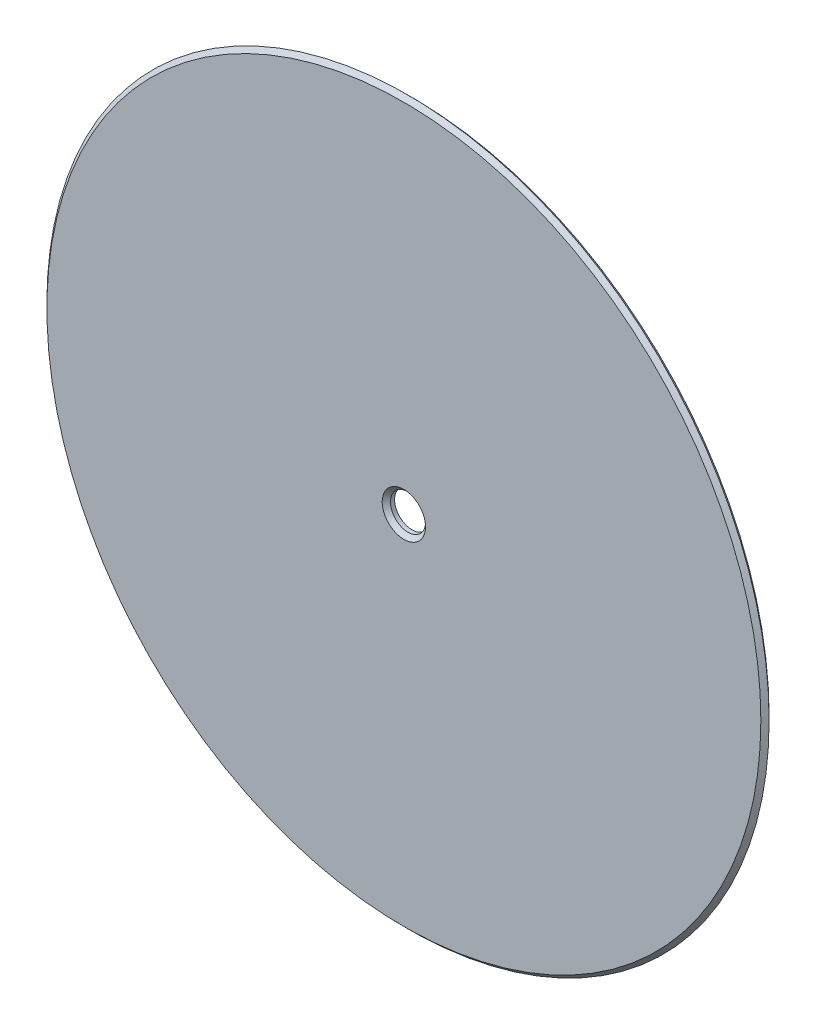
ISO-10303-21;
HEADER;
FILE_DESCRIPTION(('STEP AP214'),'2;1');
FILE_NAME('part.step','',(''),(''),'','','');
FILE_SCHEMA(('AUTOMOTIVE_DESIGN { 1 0 10303 214 1 1 1 1 }'));
ENDSEC;
DATA;
#1=APPLICATION_CONTEXT('core data for automotive mechanical design processes');
#2=APPLICATION_PROTOCOL_DEFINITION('international standard','automotive_design',2000,#1);
#3=PRODUCT_CONTEXT('',#1,'mechanical');
#4=PRODUCT('Part','Part','',(#3));
#5=PRODUCT_RELATED_PRODUCT_CATEGORY('part','',(#4));
#6=PRODUCT_DEFINITION_FORMATION('','',#4);
#7=PRODUCT_DEFINITION_CONTEXT('part definition',#1,'design');
#8=PRODUCT_DEFINITION('design','',#6,#7);
#9=PRODUCT_DEFINITION_SHAPE('','',#8);
#10=(LENGTH_UNIT() NAMED_UNIT(*) SI_UNIT(.MILLI.,.METRE.));
#11=(NAMED_UNIT(*) PLANE_ANGLE_UNIT() SI_UNIT($,.RADIAN.));
#12=(NAMED_UNIT(*) SI_UNIT($,.STERADIAN.) SOLID_ANGLE_UNIT());
#13=UNCERTAINTY_MEASURE_WITH_UNIT(LENGTH_MEASURE(1.E-05),#10,'distance_accuracy_value','');
#14=(GEOMETRIC_REPRESENTATION_CONTEXT(3) GLOBAL_UNCERTAINTY_ASSIGNED_CONTEXT((#13)) GLOBAL_UNIT_ASSIGNED_CONTEXT((#10,
#11,#12)) REPRESENTATION_CONTEXT('',''));
#15=CARTESIAN_POINT('',(0.,0.,0.));
#16=DIRECTION('',(0.,0.,1.));
#17=DIRECTION('',(1.,0.,0.));
#18=AXIS2_PLACEMENT_3D('',#15,#16,#17);
#19=CARTESIAN_POINT('',(0.,0.,1.016));
#20=DIRECTION('',(0.,0.,1.));
#21=DIRECTION('',(1.,0.,0.));
#22=AXIS2_PLACEMENT_3D('',#19,#20,#21);
#23=PLANE('',#22);
#24=CARTESIAN_POINT('',(0.,0.,1.016));
#25=DIRECTION('',(0.,0.,1.));
#26=DIRECTION('',(1.,0.,0.));
#27=AXIS2_PLACEMENT_3D('',#24,#25,#26);
#28=CIRCLE('',#27,2.667);
#29=CARTESIAN_POINT('',(2.667,0.,1.016));
#30=VERTEX_POINT('',#29);
#31=EDGE_CURVE('E39',#30,#30,#28,.F.);
#32=ORIENTED_EDGE('',*,*,#31,.T.);
#33=EDGE_LOOP('',(#32));
#34=FACE_BOUND('',#33,.T.);
#35=CARTESIAN_POINT('',(0.,0.,1.016));
#36=DIRECTION('',(0.,0.,1.));
#37=DIRECTION('',(1.,0.,0.));
#38=AXIS2_PLACEMENT_3D('',#35,#36,#37);
#39=CIRCLE('',#38,43.942);
#40=CARTESIAN_POINT('',(43.942,0.,1.016));
#41=VERTEX_POINT('',#40);
#42=EDGE_CURVE('E43',#41,#41,#39,.T.);
#43=ORIENTED_EDGE('',*,*,#42,.T.);
#44=EDGE_LOOP('',(#43));
#45=FACE_BOUND('',#44,.T.);
#46=ADVANCED_FACE('F31',(#34,#45),#23,.T.);
#47=CARTESIAN_POINT('',(0.,0.,0.));
#48=DIRECTION('',(0.,0.,1.));
#49=DIRECTION('',(1.,0.,0.));
#50=AXIS2_PLACEMENT_3D('',#47,#48,#49);
#51=PLANE('',#50);
#52=CARTESIAN_POINT('',(0.,0.,0.));
#53=DIRECTION('',(0.,0.,1.));
#54=DIRECTION('',(1.,0.,0.));
#55=AXIS2_PLACEMENT_3D('',#52,#53,#54);
#56=CIRCLE('',#55,43.942);
#57=CARTESIAN_POINT('',(43.942,0.,0.));
#58=VERTEX_POINT('',#57);
#59=EDGE_CURVE('E10',#58,#58,#56,.F.);
#60=ORIENTED_EDGE('',*,*,#59,.T.);
#61=EDGE_LOOP('',(#60));
#62=FACE_BOUND('',#61,.T.);
#63=CARTESIAN_POINT('',(0.,0.,0.));
#64=DIRECTION('',(0.,0.,1.));
#65=DIRECTION('',(1.,0.,0.));
#66=AXIS2_PLACEMENT_3D('',#63,#64,#65);
#67=CIRCLE('',#66,2.159);
#68=CARTESIAN_POINT('',(2.159,0.,0.));
#69=VERTEX_POINT('',#68);
#70=EDGE_CURVE('E51',#69,#69,#67,.T.);
#71=ORIENTED_EDGE('',*,*,#70,.T.);
#72=EDGE_LOOP('',(#71));
#73=FACE_BOUND('',#72,.T.);
#74=ADVANCED_FACE('F72',(#62,#73),#51,.F.);
#75=CARTESIAN_POINT('',(0.,0.,1.016));
#76=DIRECTION('',(0.,0.,-1.));
#77=DIRECTION('',(-1.,0.,0.));
#78=AXIS2_PLACEMENT_3D('',#75,#76,#77);
#79=CYLINDRICAL_SURFACE('',#78,2.159);
#80=CARTESIAN_POINT('',(0.,0.,0.507999999999989));
#81=DIRECTION('',(0.,0.,1.));
#82=DIRECTION('',(1.,0.,0.));
#83=AXIS2_PLACEMENT_3D('',#80,#81,#82);
#84=CIRCLE('',#83,2.159);
#85=CARTESIAN_POINT('',(2.159,0.,0.507999999999989));
#86=VERTEX_POINT('',#85);
#87=EDGE_CURVE('E48',#86,#86,#84,.T.);
#88=ORIENTED_EDGE('',*,*,#87,.T.);
#89=EDGE_LOOP('',(#88));
#90=FACE_BOUND('',#89,.T.);
#91=ORIENTED_EDGE('',*,*,#70,.F.);
#92=EDGE_LOOP('',(#91));
#93=FACE_BOUND('',#92,.T.);
#94=ADVANCED_FACE('F68',(#90,#93),#79,.F.);
#95=CARTESIAN_POINT('',(0.,0.,0.507999999999989));
#96=DIRECTION('',(0.,0.,1.));
#97=DIRECTION('',(1.,0.,0.));
#98=AXIS2_PLACEMENT_3D('',#95,#96,#97);
#99=CONICAL_SURFACE('',#98,2.159,0.785398163397441);
#100=ORIENTED_EDGE('',*,*,#31,.F.);
#101=EDGE_LOOP('',(#100));
#102=FACE_BOUND('',#101,.T.);
#103=ORIENTED_EDGE('',*,*,#87,.F.);
#104=EDGE_LOOP('',(#103));
#105=FACE_BOUND('',#104,.T.);
#106=ADVANCED_FACE('F62',(#102,#105),#99,.F.);
#107=CARTESIAN_POINT('',(0.,0.,0.508000000000008));
#108=DIRECTION('',(0.,0.,1.));
#109=DIRECTION('',(1.,0.,0.));
#110=AXIS2_PLACEMENT_3D('',#107,#108,#109);
#111=CONICAL_SURFACE('',#110,44.45,0.785398163397448);
#112=ORIENTED_EDGE('',*,*,#59,.F.);
#113=EDGE_LOOP('',(#112));
#114=FACE_BOUND('',#113,.T.);
#115=CARTESIAN_POINT('',(0.,0.,0.508000000000008));
#116=DIRECTION('',(0.,0.,1.));
#117=DIRECTION('',(1.,0.,0.));
#118=AXIS2_PLACEMENT_3D('',#115,#116,#117);
#119=CIRCLE('',#118,44.45);
#120=CARTESIAN_POINT('',(44.45,0.,0.508000000000008));
#121=VERTEX_POINT('',#120);
#122=EDGE_CURVE('E35',#121,#121,#119,.T.);
#123=ORIENTED_EDGE('',*,*,#122,.F.);
#124=EDGE_LOOP('',(#123));
#125=FACE_BOUND('',#124,.T.);
#126=ADVANCED_FACE('F33',(#114,#125),#111,.T.);
#127=CARTESIAN_POINT('',(0.,0.,1.016));
#128=DIRECTION('',(0.,0.,-1.));
#129=DIRECTION('',(-1.,0.,0.));
#130=AXIS2_PLACEMENT_3D('',#127,#128,#129);
#131=CONICAL_SURFACE('',#130,43.942,0.785398163397462);
#132=ORIENTED_EDGE('',*,*,#122,.T.);
#133=EDGE_LOOP('',(#132));
#134=FACE_BOUND('',#133,.T.);
#135=ORIENTED_EDGE('',*,*,#42,.F.);
#136=EDGE_LOOP('',(#135));
#137=FACE_BOUND('',#136,.T.);
#138=ADVANCED_FACE('F58',(#134,#137),#131,.T.);
#139=CLOSED_SHELL('',(#46,#74,#94,#106,#126,#138));
#140=MANIFOLD_SOLID_BREP('B2',#139);
#141=ADVANCED_BREP_SHAPE_REPRESENTATION('',(#18,#140),#14);
#142=SHAPE_DEFINITION_REPRESENTATION(#9,#141);
ENDSEC;
END-ISO-10303-21;
